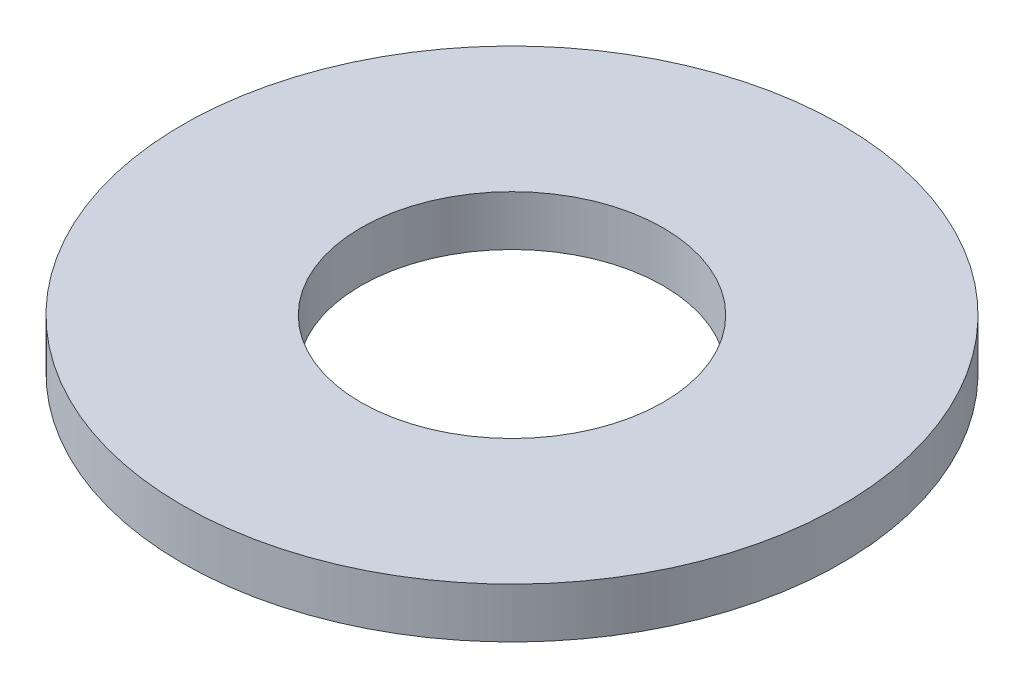
ISO-10303-21;
HEADER;
FILE_DESCRIPTION(('STEP AP214'),'2;1');
FILE_NAME('part.step','',(''),(''),'','','');
FILE_SCHEMA(('AUTOMOTIVE_DESIGN { 1 0 10303 214 1 1 1 1 }'));
ENDSEC;
DATA;
#1=APPLICATION_CONTEXT('core data for automotive mechanical design processes');
#2=APPLICATION_PROTOCOL_DEFINITION('international standard','automotive_design',2000,#1);
#3=PRODUCT_CONTEXT('',#1,'mechanical');
#4=PRODUCT('Part','Part','',(#3));
#5=PRODUCT_RELATED_PRODUCT_CATEGORY('part','',(#4));
#6=PRODUCT_DEFINITION_FORMATION('','',#4);
#7=PRODUCT_DEFINITION_CONTEXT('part definition',#1,'design');
#8=PRODUCT_DEFINITION('design','',#6,#7);
#9=PRODUCT_DEFINITION_SHAPE('','',#8);
#10=(LENGTH_UNIT() NAMED_UNIT(*) SI_UNIT(.MILLI.,.METRE.));
#11=(NAMED_UNIT(*) PLANE_ANGLE_UNIT() SI_UNIT($,.RADIAN.));
#12=(NAMED_UNIT(*) SI_UNIT($,.STERADIAN.) SOLID_ANGLE_UNIT());
#13=UNCERTAINTY_MEASURE_WITH_UNIT(LENGTH_MEASURE(1.E-05),#10,'distance_accuracy_value','');
#14=(GEOMETRIC_REPRESENTATION_CONTEXT(3) GLOBAL_UNCERTAINTY_ASSIGNED_CONTEXT((#13)) GLOBAL_UNIT_ASSIGNED_CONTEXT((#10,
#11,#12)) REPRESENTATION_CONTEXT('',''));
#15=CARTESIAN_POINT('',(0.,0.,0.));
#16=DIRECTION('',(0.,0.,1.));
#17=DIRECTION('',(1.,0.,0.));
#18=AXIS2_PLACEMENT_3D('',#15,#16,#17);
#19=CARTESIAN_POINT('',(0.,1.4478,0.));
#20=DIRECTION('',(0.,-1.,0.));
#21=DIRECTION('',(0.,0.,-1.));
#22=AXIS2_PLACEMENT_3D('',#19,#20,#21);
#23=CYLINDRICAL_SURFACE('',#22,9.525);
#24=CARTESIAN_POINT('',(0.,1.4478,0.));
#25=DIRECTION('',(0.,1.,0.));
#26=DIRECTION('',(0.,0.,1.));
#27=AXIS2_PLACEMENT_3D('',#24,#25,#26);
#28=CIRCLE('',#27,9.525);
#29=CARTESIAN_POINT('',(0.,1.4478,9.525));
#30=VERTEX_POINT('',#29);
#31=EDGE_CURVE('E10',#30,#30,#28,.T.);
#32=ORIENTED_EDGE('',*,*,#31,.F.);
#33=EDGE_LOOP('',(#32));
#34=FACE_BOUND('',#33,.T.);
#35=CARTESIAN_POINT('',(0.,0.,0.));
#36=DIRECTION('',(0.,1.,0.));
#37=DIRECTION('',(0.,0.,1.));
#38=AXIS2_PLACEMENT_3D('',#35,#36,#37);
#39=CIRCLE('',#38,9.525);
#40=CARTESIAN_POINT('',(0.,0.,9.525));
#41=VERTEX_POINT('',#40);
#42=EDGE_CURVE('E31',#41,#41,#39,.T.);
#43=ORIENTED_EDGE('',*,*,#42,.T.);
#44=EDGE_LOOP('',(#43));
#45=FACE_BOUND('',#44,.T.);
#46=ADVANCED_FACE('F28',(#34,#45),#23,.T.);
#47=CARTESIAN_POINT('',(0.,1.4478,0.));
#48=DIRECTION('',(0.,1.,0.));
#49=DIRECTION('',(0.,0.,1.));
#50=AXIS2_PLACEMENT_3D('',#47,#48,#49);
#51=PLANE('',#50);
#52=CARTESIAN_POINT('',(0.,1.4478,0.));
#53=DIRECTION('',(0.,1.,0.));
#54=DIRECTION('',(0.,0.,1.));
#55=AXIS2_PLACEMENT_3D('',#52,#53,#54);
#56=CIRCLE('',#55,4.3688);
#57=CARTESIAN_POINT('',(0.,1.4478,4.3688));
#58=VERTEX_POINT('',#57);
#59=EDGE_CURVE('E40',#58,#58,#56,.T.);
#60=ORIENTED_EDGE('',*,*,#59,.F.);
#61=EDGE_LOOP('',(#60));
#62=FACE_BOUND('',#61,.T.);
#63=ORIENTED_EDGE('',*,*,#31,.T.);
#64=EDGE_LOOP('',(#63));
#65=FACE_BOUND('',#64,.T.);
#66=ADVANCED_FACE('F55',(#62,#65),#51,.T.);
#67=CARTESIAN_POINT('',(0.,0.,0.));
#68=DIRECTION('',(0.,1.,0.));
#69=DIRECTION('',(0.,0.,1.));
#70=AXIS2_PLACEMENT_3D('',#67,#68,#69);
#71=PLANE('',#70);
#72=CARTESIAN_POINT('',(0.,0.,0.));
#73=DIRECTION('',(0.,1.,0.));
#74=DIRECTION('',(0.,0.,1.));
#75=AXIS2_PLACEMENT_3D('',#72,#73,#74);
#76=CIRCLE('',#75,4.3688);
#77=CARTESIAN_POINT('',(0.,0.,4.3688));
#78=VERTEX_POINT('',#77);
#79=EDGE_CURVE('E38',#78,#78,#76,.T.);
#80=ORIENTED_EDGE('',*,*,#79,.T.);
#81=EDGE_LOOP('',(#80));
#82=FACE_BOUND('',#81,.T.);
#83=ORIENTED_EDGE('',*,*,#42,.F.);
#84=EDGE_LOOP('',(#83));
#85=FACE_BOUND('',#84,.T.);
#86=ADVANCED_FACE('F46',(#82,#85),#71,.F.);
#87=CARTESIAN_POINT('',(0.,0.,0.));
#88=DIRECTION('',(0.,1.,0.));
#89=DIRECTION('',(0.,0.,1.));
#90=AXIS2_PLACEMENT_3D('',#87,#88,#89);
#91=CYLINDRICAL_SURFACE('',#90,4.3688);
#92=ORIENTED_EDGE('',*,*,#79,.F.);
#93=EDGE_LOOP('',(#92));
#94=FACE_BOUND('',#93,.T.);
#95=ORIENTED_EDGE('',*,*,#59,.T.);
#96=EDGE_LOOP('',(#95));
#97=FACE_BOUND('',#96,.T.);
#98=ADVANCED_FACE('F49',(#94,#97),#91,.F.);
#99=CLOSED_SHELL('',(#46,#66,#86,#98));
#100=MANIFOLD_SOLID_BREP('B2',#99);
#101=ADVANCED_BREP_SHAPE_REPRESENTATION('',(#18,#100),#14);
#102=SHAPE_DEFINITION_REPRESENTATION(#9,#101);
ENDSEC;
END-ISO-10303-21;
